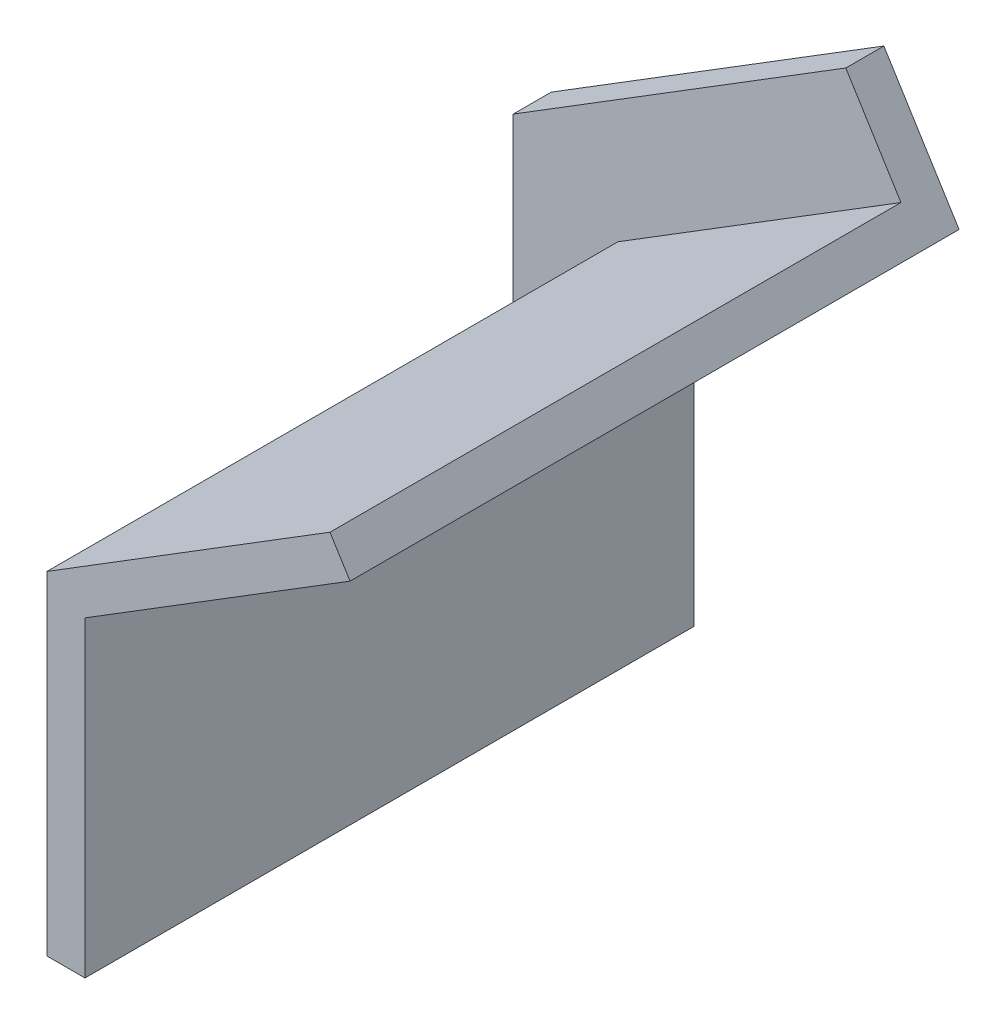
ISO-10303-21;
HEADER;
FILE_DESCRIPTION(('STEP AP214'),'2;1');
FILE_NAME('part.step','',(''),(''),'','','');
FILE_SCHEMA(('AUTOMOTIVE_DESIGN { 1 0 10303 214 1 1 1 1 }'));
ENDSEC;
DATA;
#1=APPLICATION_CONTEXT('core data for automotive mechanical design processes');
#2=APPLICATION_PROTOCOL_DEFINITION('international standard','automotive_design',2000,#1);
#3=PRODUCT_CONTEXT('',#1,'mechanical');
#4=PRODUCT('Part','Part','',(#3));
#5=PRODUCT_RELATED_PRODUCT_CATEGORY('part','',(#4));
#6=PRODUCT_DEFINITION_FORMATION('','',#4);
#7=PRODUCT_DEFINITION_CONTEXT('part definition',#1,'design');
#8=PRODUCT_DEFINITION('design','',#6,#7);
#9=PRODUCT_DEFINITION_SHAPE('','',#8);
#10=(LENGTH_UNIT() NAMED_UNIT(*) SI_UNIT(.MILLI.,.METRE.));
#11=(NAMED_UNIT(*) PLANE_ANGLE_UNIT() SI_UNIT($,.RADIAN.));
#12=(NAMED_UNIT(*) SI_UNIT($,.STERADIAN.) SOLID_ANGLE_UNIT());
#13=UNCERTAINTY_MEASURE_WITH_UNIT(LENGTH_MEASURE(1.E-05),#10,'distance_accuracy_value','');
#14=(GEOMETRIC_REPRESENTATION_CONTEXT(3) GLOBAL_UNCERTAINTY_ASSIGNED_CONTEXT((#13)) GLOBAL_UNIT_ASSIGNED_CONTEXT((#10,
#11,#12)) REPRESENTATION_CONTEXT('',''));
#15=CARTESIAN_POINT('',(0.,0.,0.));
#16=DIRECTION('',(0.,0.,1.));
#17=DIRECTION('',(1.,0.,0.));
#18=AXIS2_PLACEMENT_3D('',#15,#16,#17);
#19=CARTESIAN_POINT('',(0.,0.,60.));
#20=DIRECTION('',(1.,0.,0.));
#21=DIRECTION('',(0.,1.,0.));
#22=AXIS2_PLACEMENT_3D('',#19,#20,#21);
#23=PLANE('',#22);
#24=DIRECTION('',(0.,-1.,0.));
#25=VECTOR('',#24,1.);
#26=CARTESIAN_POINT('',(0.,0.,-60.));
#27=LINE('',#26,#25);
#28=CARTESIAN_POINT('',(0.,0.,-60.));
#29=VERTEX_POINT('',#28);
#30=CARTESIAN_POINT('',(0.,-70.,-60.));
#31=VERTEX_POINT('',#30);
#32=EDGE_CURVE('E159',#29,#31,#27,.T.);
#33=ORIENTED_EDGE('',*,*,#32,.T.);
#34=DIRECTION('',(0.,0.,-1.));
#35=VECTOR('',#34,1.);
#36=CARTESIAN_POINT('',(0.,-70.,60.));
#37=LINE('',#36,#35);
#38=CARTESIAN_POINT('',(0.,-70.,60.));
#39=VERTEX_POINT('',#38);
#40=EDGE_CURVE('E11',#39,#31,#37,.T.);
#41=ORIENTED_EDGE('',*,*,#40,.F.);
#42=DIRECTION('',(0.,-1.,0.));
#43=VECTOR('',#42,1.);
#44=CARTESIAN_POINT('',(0.,0.,60.));
#45=LINE('',#44,#43);
#46=CARTESIAN_POINT('',(0.,0.,60.));
#47=VERTEX_POINT('',#46);
#48=EDGE_CURVE('E160',#47,#39,#45,.T.);
#49=ORIENTED_EDGE('',*,*,#48,.F.);
#50=DIRECTION('',(0.,0.,-1.));
#51=VECTOR('',#50,1.);
#52=CARTESIAN_POINT('',(0.,0.,60.));
#53=LINE('',#52,#51);
#54=EDGE_CURVE('E171',#47,#29,#53,.T.);
#55=ORIENTED_EDGE('',*,*,#54,.T.);
#56=EDGE_LOOP('',(#33,#41,#49,#55));
#57=FACE_BOUND('',#56,.T.);
#58=ADVANCED_FACE('F43',(#57),#23,.F.);
#59=CARTESIAN_POINT('',(0.,-70.,60.));
#60=DIRECTION('',(0.,1.,0.));
#61=DIRECTION('',(0.,0.,1.));
#62=AXIS2_PLACEMENT_3D('',#59,#60,#61);
#63=PLANE('',#62);
#64=ORIENTED_EDGE('',*,*,#40,.T.);
#65=DIRECTION('',(-1.,0.,0.));
#66=VECTOR('',#65,1.);
#67=CARTESIAN_POINT('',(-22.,-70.,-60.));
#68=LINE('',#67,#66);
#69=CARTESIAN_POINT('',(-22.,-70.,-60.));
#70=VERTEX_POINT('',#69);
#71=EDGE_CURVE('E146',#31,#70,#68,.T.);
#72=ORIENTED_EDGE('',*,*,#71,.T.);
#73=DIRECTION('',(0.,0.,1.));
#74=VECTOR('',#73,1.);
#75=CARTESIAN_POINT('',(-22.,-70.,-68.));
#76=LINE('',#75,#74);
#77=CARTESIAN_POINT('',(-22.,-70.,-68.));
#78=VERTEX_POINT('',#77);
#79=EDGE_CURVE('E156',#78,#70,#76,.T.);
#80=ORIENTED_EDGE('',*,*,#79,.F.);
#81=DIRECTION('',(-1.,0.,0.));
#82=VECTOR('',#81,1.);
#83=CARTESIAN_POINT('',(0.,-70.,-68.));
#84=LINE('',#83,#82);
#85=CARTESIAN_POINT('',(8.00000000000001,-70.,-68.));
#86=VERTEX_POINT('',#85);
#87=EDGE_CURVE('E127',#86,#78,#84,.T.);
#88=ORIENTED_EDGE('',*,*,#87,.F.);
#89=DIRECTION('',(0.,0.,-1.));
#90=VECTOR('',#89,1.);
#91=CARTESIAN_POINT('',(8.00000000000001,-70.,60.));
#92=LINE('',#91,#90);
#93=CARTESIAN_POINT('',(8.00000000000001,-70.,60.));
#94=VERTEX_POINT('',#93);
#95=EDGE_CURVE('E51',#94,#86,#92,.T.);
#96=ORIENTED_EDGE('',*,*,#95,.F.);
#97=DIRECTION('',(1.,0.,0.));
#98=VECTOR('',#97,1.);
#99=CARTESIAN_POINT('',(0.,-70.,60.));
#100=LINE('',#99,#98);
#101=EDGE_CURVE('E162',#39,#94,#100,.T.);
#102=ORIENTED_EDGE('',*,*,#101,.F.);
#103=EDGE_LOOP('',(#64,#72,#80,#88,#96,#102));
#104=FACE_BOUND('',#103,.T.);
#105=ADVANCED_FACE('F189',(#104),#63,.F.);
#106=CARTESIAN_POINT('',(8.,-4.45274287831187,60.));
#107=DIRECTION('',(-1.,0.,0.));
#108=DIRECTION('',(0.,-1.,0.));
#109=AXIS2_PLACEMENT_3D('',#106,#107,#108);
#110=PLANE('',#109);
#111=ORIENTED_EDGE('',*,*,#95,.T.);
#112=DIRECTION('',(0.,-1.,0.));
#113=VECTOR('',#112,1.);
#114=CARTESIAN_POINT('',(8.00000000000001,-70.,-68.));
#115=LINE('',#114,#113);
#116=CARTESIAN_POINT('',(8.,-4.45274287831187,-68.));
#117=VERTEX_POINT('',#116);
#118=EDGE_CURVE('E122',#117,#86,#115,.T.);
#119=ORIENTED_EDGE('',*,*,#118,.F.);
#120=DIRECTION('',(0.,0.,-1.));
#121=VECTOR('',#120,1.);
#122=CARTESIAN_POINT('',(8.,-4.45274287831187,60.));
#123=LINE('',#122,#121);
#124=CARTESIAN_POINT('',(8.,-4.45274287831187,60.));
#125=VERTEX_POINT('',#124);
#126=EDGE_CURVE('E110',#125,#117,#123,.T.);
#127=ORIENTED_EDGE('',*,*,#126,.F.);
#128=DIRECTION('',(0.,1.,0.));
#129=VECTOR('',#128,1.);
#130=CARTESIAN_POINT('',(8.,-4.45274287831187,60.));
#131=LINE('',#130,#129);
#132=EDGE_CURVE('E165',#94,#125,#131,.T.);
#133=ORIENTED_EDGE('',*,*,#132,.F.);
#134=EDGE_LOOP('',(#111,#119,#127,#133));
#135=FACE_BOUND('',#134,.T.);
#136=ADVANCED_FACE('F123',(#135),#110,.F.);
#137=CARTESIAN_POINT('',(8.,-4.45274287831187,60.));
#138=DIRECTION('',(-0.526955795496682,0.849892692986861,0.));
#139=DIRECTION('',(-0.849892692986862,-0.526955795496682,0.));
#140=AXIS2_PLACEMENT_3D('',#137,#138,#139);
#141=PLANE('',#140);
#142=ORIENTED_EDGE('',*,*,#126,.T.);
#143=DIRECTION('',(-0.849892692986861,-0.526955795496682,0.));
#144=VECTOR('',#143,1.);
#145=CARTESIAN_POINT('',(8.,-4.45274287831187,-68.));
#146=LINE('',#145,#144);
#147=CARTESIAN_POINT('',(63.7081348730538,30.0877641408728,-68.));
#148=VERTEX_POINT('',#147);
#149=EDGE_CURVE('E115',#148,#117,#146,.T.);
#150=ORIENTED_EDGE('',*,*,#149,.F.);
#151=DIRECTION('',(0.,0.,-1.));
#152=VECTOR('',#151,1.);
#153=CARTESIAN_POINT('',(63.7081348730538,30.0877641408728,60.));
#154=LINE('',#153,#152);
#155=CARTESIAN_POINT('',(63.7081348730538,30.0877641408728,60.));
#156=VERTEX_POINT('',#155);
#157=EDGE_CURVE('E119',#156,#148,#154,.T.);
#158=ORIENTED_EDGE('',*,*,#157,.F.);
#159=DIRECTION('',(0.849892692986861,0.526955795496682,0.));
#160=VECTOR('',#159,1.);
#161=CARTESIAN_POINT('',(8.,-4.45274287831187,60.));
#162=LINE('',#161,#160);
#163=EDGE_CURVE('E116',#125,#156,#162,.T.);
#164=ORIENTED_EDGE('',*,*,#163,.F.);
#165=EDGE_LOOP('',(#142,#150,#158,#164));
#166=FACE_BOUND('',#165,.T.);
#167=ADVANCED_FACE('F112',(#166),#141,.F.);
#168=CARTESIAN_POINT('',(59.4924885090803,36.8869056847677,60.));
#169=DIRECTION('',(-0.849892692986861,-0.526955795496682,0.));
#170=DIRECTION('',(0.526955795496682,-0.849892692986861,0.));
#171=AXIS2_PLACEMENT_3D('',#168,#169,#170);
#172=PLANE('',#171);
#173=ORIENTED_EDGE('',*,*,#157,.T.);
#174=DIRECTION('',(0.526955795496682,-0.849892692986861,0.));
#175=VECTOR('',#174,1.);
#176=CARTESIAN_POINT('',(63.7081348730538,30.0877641408728,-68.));
#177=LINE('',#176,#175);
#178=CARTESIAN_POINT('',(47.8994610081533,55.5845449304787,-68.));
#179=VERTEX_POINT('',#178);
#180=EDGE_CURVE('E132',#179,#148,#177,.T.);
#181=ORIENTED_EDGE('',*,*,#180,.F.);
#182=DIRECTION('',(0.,0.,1.));
#183=VECTOR('',#182,1.);
#184=CARTESIAN_POINT('',(47.8994610081533,55.5845449304787,-68.));
#185=LINE('',#184,#183);
#186=CARTESIAN_POINT('',(47.8994610081533,55.5845449304787,-60.));
#187=VERTEX_POINT('',#186);
#188=EDGE_CURVE('E145',#179,#187,#185,.T.);
#189=ORIENTED_EDGE('',*,*,#188,.T.);
#190=DIRECTION('',(0.526955795496682,-0.849892692986861,0.));
#191=VECTOR('',#190,1.);
#192=CARTESIAN_POINT('',(63.7081348730538,30.0877641408728,-60.));
#193=LINE('',#192,#191);
#194=CARTESIAN_POINT('',(59.4924885090803,36.8869056847677,-60.));
#195=VERTEX_POINT('',#194);
#196=EDGE_CURVE('E133',#187,#195,#193,.T.);
#197=ORIENTED_EDGE('',*,*,#196,.T.);
#198=DIRECTION('',(0.,0.,-1.));
#199=VECTOR('',#198,1.);
#200=CARTESIAN_POINT('',(59.4924885090803,36.8869056847677,60.));
#201=LINE('',#200,#199);
#202=CARTESIAN_POINT('',(59.4924885090803,36.8869056847677,60.));
#203=VERTEX_POINT('',#202);
#204=EDGE_CURVE('E178',#203,#195,#201,.T.);
#205=ORIENTED_EDGE('',*,*,#204,.F.);
#206=DIRECTION('',(-0.526955795496682,0.849892692986861,0.));
#207=VECTOR('',#206,1.);
#208=CARTESIAN_POINT('',(59.4924885090803,36.8869056847677,60.));
#209=LINE('',#208,#207);
#210=EDGE_CURVE('E168',#156,#203,#209,.T.);
#211=ORIENTED_EDGE('',*,*,#210,.F.);
#212=EDGE_LOOP('',(#173,#181,#189,#197,#205,#211));
#213=FACE_BOUND('',#212,.T.);
#214=ADVANCED_FACE('F183',(#213),#172,.F.);
#215=CARTESIAN_POINT('',(0.,0.,60.));
#216=DIRECTION('',(0.526955795496682,-0.849892692986861,0.));
#217=DIRECTION('',(0.849892692986861,0.526955795496682,0.));
#218=AXIS2_PLACEMENT_3D('',#215,#216,#217);
#219=PLANE('',#218);
#220=DIRECTION('',(-0.849892692986862,-0.526955795496682,0.));
#221=VECTOR('',#220,1.);
#222=CARTESIAN_POINT('',(0.,0.,-60.));
#223=LINE('',#222,#221);
#224=EDGE_CURVE('E163',#195,#29,#223,.T.);
#225=ORIENTED_EDGE('',*,*,#224,.T.);
#226=ORIENTED_EDGE('',*,*,#54,.F.);
#227=DIRECTION('',(-0.849892692986862,-0.526955795496682,0.));
#228=VECTOR('',#227,1.);
#229=CARTESIAN_POINT('',(0.,0.,60.));
#230=LINE('',#229,#228);
#231=EDGE_CURVE('E58',#203,#47,#230,.T.);
#232=ORIENTED_EDGE('',*,*,#231,.F.);
#233=ORIENTED_EDGE('',*,*,#204,.T.);
#234=EDGE_LOOP('',(#225,#226,#232,#233));
#235=FACE_BOUND('',#234,.T.);
#236=ADVANCED_FACE('F206',(#235),#219,.F.);
#237=CARTESIAN_POINT('',(0.,0.,60.));
#238=DIRECTION('',(0.,0.,1.));
#239=DIRECTION('',(1.,0.,0.));
#240=AXIS2_PLACEMENT_3D('',#237,#238,#239);
#241=PLANE('',#240);
#242=ORIENTED_EDGE('',*,*,#48,.T.);
#243=ORIENTED_EDGE('',*,*,#101,.T.);
#244=ORIENTED_EDGE('',*,*,#132,.T.);
#245=ORIENTED_EDGE('',*,*,#163,.T.);
#246=ORIENTED_EDGE('',*,*,#210,.T.);
#247=ORIENTED_EDGE('',*,*,#231,.T.);
#248=EDGE_LOOP('',(#242,#243,#244,#245,#246,#247));
#249=FACE_BOUND('',#248,.T.);
#250=ADVANCED_FACE('F185',(#249),#241,.T.);
#251=CARTESIAN_POINT('',(0.,0.,-60.));
#252=DIRECTION('',(0.,0.,1.));
#253=DIRECTION('',(1.,0.,0.));
#254=AXIS2_PLACEMENT_3D('',#251,#252,#253);
#255=PLANE('',#254);
#256=ORIENTED_EDGE('',*,*,#32,.F.);
#257=ORIENTED_EDGE('',*,*,#224,.F.);
#258=ORIENTED_EDGE('',*,*,#196,.F.);
#259=DIRECTION('',(0.849892692986861,0.526955795496682,0.));
#260=VECTOR('',#259,1.);
#261=CARTESIAN_POINT('',(47.8994610081533,55.5845449304787,-60.));
#262=LINE('',#261,#260);
#263=CARTESIAN_POINT('',(-22.,12.2450429153576,-60.));
#264=VERTEX_POINT('',#263);
#265=EDGE_CURVE('E136',#264,#187,#262,.T.);
#266=ORIENTED_EDGE('',*,*,#265,.F.);
#267=DIRECTION('',(0.,1.,0.));
#268=VECTOR('',#267,1.);
#269=CARTESIAN_POINT('',(-22.,12.2450429153576,-60.));
#270=LINE('',#269,#268);
#271=EDGE_CURVE('E148',#70,#264,#270,.T.);
#272=ORIENTED_EDGE('',*,*,#271,.F.);
#273=ORIENTED_EDGE('',*,*,#71,.F.);
#274=EDGE_LOOP('',(#256,#257,#258,#266,#272,#273));
#275=FACE_BOUND('',#274,.T.);
#276=ADVANCED_FACE('F204',(#275),#255,.T.);
#277=CARTESIAN_POINT('',(-22.,12.2450429153576,-68.));
#278=DIRECTION('',(1.,0.,0.));
#279=DIRECTION('',(0.,1.,0.));
#280=AXIS2_PLACEMENT_3D('',#277,#278,#279);
#281=PLANE('',#280);
#282=ORIENTED_EDGE('',*,*,#271,.T.);
#283=DIRECTION('',(0.,0.,1.));
#284=VECTOR('',#283,1.);
#285=CARTESIAN_POINT('',(-22.,12.2450429153576,-68.));
#286=LINE('',#285,#284);
#287=CARTESIAN_POINT('',(-22.,12.2450429153576,-68.));
#288=VERTEX_POINT('',#287);
#289=EDGE_CURVE('E153',#288,#264,#286,.T.);
#290=ORIENTED_EDGE('',*,*,#289,.F.);
#291=DIRECTION('',(0.,1.,0.));
#292=VECTOR('',#291,1.);
#293=CARTESIAN_POINT('',(-22.,12.2450429153576,-68.));
#294=LINE('',#293,#292);
#295=EDGE_CURVE('E140',#78,#288,#294,.T.);
#296=ORIENTED_EDGE('',*,*,#295,.F.);
#297=ORIENTED_EDGE('',*,*,#79,.T.);
#298=EDGE_LOOP('',(#282,#290,#296,#297));
#299=FACE_BOUND('',#298,.T.);
#300=ADVANCED_FACE('F196',(#299),#281,.F.);
#301=CARTESIAN_POINT('',(47.8994610081533,55.5845449304787,-68.));
#302=DIRECTION('',(0.526955795496682,-0.849892692986861,0.));
#303=DIRECTION('',(0.849892692986861,0.526955795496682,0.));
#304=AXIS2_PLACEMENT_3D('',#301,#302,#303);
#305=PLANE('',#304);
#306=ORIENTED_EDGE('',*,*,#265,.T.);
#307=ORIENTED_EDGE('',*,*,#188,.F.);
#308=DIRECTION('',(0.849892692986861,0.526955795496682,0.));
#309=VECTOR('',#308,1.);
#310=CARTESIAN_POINT('',(47.8994610081533,55.5845449304787,-68.));
#311=LINE('',#310,#309);
#312=EDGE_CURVE('E142',#288,#179,#311,.T.);
#313=ORIENTED_EDGE('',*,*,#312,.F.);
#314=ORIENTED_EDGE('',*,*,#289,.T.);
#315=EDGE_LOOP('',(#306,#307,#313,#314));
#316=FACE_BOUND('',#315,.T.);
#317=ADVANCED_FACE('F200',(#316),#305,.F.);
#318=CARTESIAN_POINT('',(0.,0.,-68.));
#319=DIRECTION('',(0.,0.,1.));
#320=DIRECTION('',(1.,0.,0.));
#321=AXIS2_PLACEMENT_3D('',#318,#319,#320);
#322=PLANE('',#321);
#323=ORIENTED_EDGE('',*,*,#149,.T.);
#324=ORIENTED_EDGE('',*,*,#118,.T.);
#325=ORIENTED_EDGE('',*,*,#87,.T.);
#326=ORIENTED_EDGE('',*,*,#295,.T.);
#327=ORIENTED_EDGE('',*,*,#312,.T.);
#328=ORIENTED_EDGE('',*,*,#180,.T.);
#329=EDGE_LOOP('',(#323,#324,#325,#326,#327,#328));
#330=FACE_BOUND('',#329,.T.);
#331=ADVANCED_FACE('F130',(#330),#322,.F.);
#332=CLOSED_SHELL('',(#58,#105,#136,#167,#214,#236,#250,#276,#300,#317,#331));
#333=MANIFOLD_SOLID_BREP('B2',#332);
#334=ADVANCED_BREP_SHAPE_REPRESENTATION('',(#18,#333),#14);
#335=SHAPE_DEFINITION_REPRESENTATION(#9,#334);
ENDSEC;
END-ISO-10303-21;
